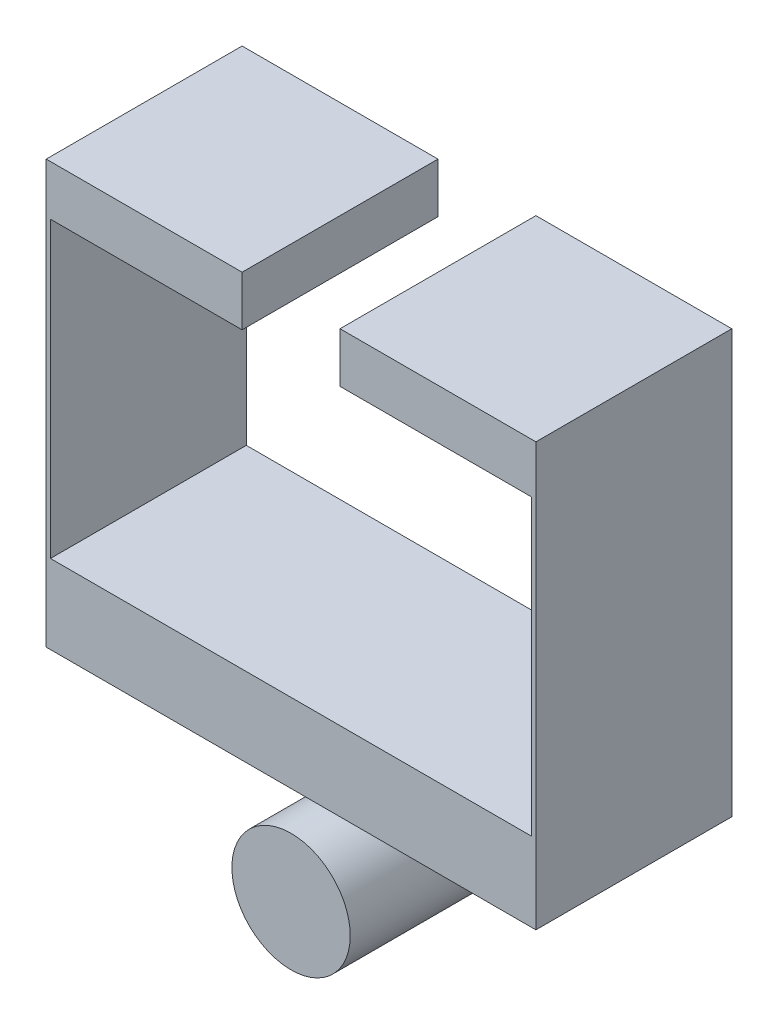
ISO-10303-21;
HEADER;
FILE_DESCRIPTION(('STEP AP214'),'2;1');
FILE_NAME('part.step','',(''),(''),'','','');
FILE_SCHEMA(('AUTOMOTIVE_DESIGN { 1 0 10303 214 1 1 1 1 }'));
ENDSEC;
DATA;
#1=APPLICATION_CONTEXT('core data for automotive mechanical design processes');
#2=APPLICATION_PROTOCOL_DEFINITION('international standard','automotive_design',2000,#1);
#3=PRODUCT_CONTEXT('',#1,'mechanical');
#4=PRODUCT('Part','Part','',(#3));
#5=PRODUCT_RELATED_PRODUCT_CATEGORY('part','',(#4));
#6=PRODUCT_DEFINITION_FORMATION('','',#4);
#7=PRODUCT_DEFINITION_CONTEXT('part definition',#1,'design');
#8=PRODUCT_DEFINITION('design','',#6,#7);
#9=PRODUCT_DEFINITION_SHAPE('','',#8);
#10=(LENGTH_UNIT() NAMED_UNIT(*) SI_UNIT(.MILLI.,.METRE.));
#11=(NAMED_UNIT(*) PLANE_ANGLE_UNIT() SI_UNIT($,.RADIAN.));
#12=(NAMED_UNIT(*) SI_UNIT($,.STERADIAN.) SOLID_ANGLE_UNIT());
#13=UNCERTAINTY_MEASURE_WITH_UNIT(LENGTH_MEASURE(1.E-05),#10,'distance_accuracy_value','');
#14=(GEOMETRIC_REPRESENTATION_CONTEXT(3) GLOBAL_UNCERTAINTY_ASSIGNED_CONTEXT((#13)) GLOBAL_UNIT_ASSIGNED_CONTEXT((#10,
#11,#12)) REPRESENTATION_CONTEXT('',''));
#15=CARTESIAN_POINT('',(0.,0.,0.));
#16=DIRECTION('',(0.,0.,1.));
#17=DIRECTION('',(1.,0.,0.));
#18=AXIS2_PLACEMENT_3D('',#15,#16,#17);
#19=CARTESIAN_POINT('',(0.,0.,25.4));
#20=DIRECTION('',(0.,0.,-1.));
#21=DIRECTION('',(-1.,0.,0.));
#22=AXIS2_PLACEMENT_3D('',#19,#20,#21);
#23=CYLINDRICAL_SURFACE('',#22,7.6728737394168);
#24=CARTESIAN_POINT('',(0.,0.,25.4));
#25=DIRECTION('',(0.,0.,1.));
#26=DIRECTION('',(1.,0.,0.));
#27=AXIS2_PLACEMENT_3D('',#24,#25,#26);
#28=CIRCLE('',#27,7.6728737394168);
#29=CARTESIAN_POINT('',(7.6728737394168,0.,25.4));
#30=VERTEX_POINT('',#29);
#31=EDGE_CURVE('E47',#30,#30,#28,.T.);
#32=ORIENTED_EDGE('',*,*,#31,.F.);
#33=EDGE_LOOP('',(#32));
#34=FACE_BOUND('',#33,.T.);
#35=DIRECTION('',(0.,0.,-1.));
#36=VECTOR('',#35,1.);
#37=CARTESIAN_POINT('',(7.6728737394168,0.,1.82042280849572));
#38=LINE('',#37,#36);
#39=CARTESIAN_POINT('',(7.6728737394168,0.,1.82042280849572));
#40=VERTEX_POINT('',#39);
#41=CARTESIAN_POINT('',(7.6728737394168,0.,0.));
#42=VERTEX_POINT('',#41);
#43=EDGE_CURVE('E266',#40,#42,#38,.T.);
#44=ORIENTED_EDGE('',*,*,#43,.F.);
#45=CARTESIAN_POINT('',(0.,0.,1.82042280849572));
#46=DIRECTION('',(0.,0.,-1.));
#47=DIRECTION('',(-1.,0.,0.));
#48=AXIS2_PLACEMENT_3D('',#45,#46,#47);
#49=CIRCLE('',#48,7.6728737394168);
#50=CARTESIAN_POINT('',(-7.6728737394168,0.,1.82042280849572));
#51=VERTEX_POINT('',#50);
#52=EDGE_CURVE('E11',#51,#40,#49,.T.);
#53=ORIENTED_EDGE('',*,*,#52,.F.);
#54=DIRECTION('',(0.,0.,-1.));
#55=VECTOR('',#54,1.);
#56=CARTESIAN_POINT('',(-7.6728737394168,0.,1.82042280849572));
#57=LINE('',#56,#55);
#58=CARTESIAN_POINT('',(-7.6728737394168,0.,0.));
#59=VERTEX_POINT('',#58);
#60=EDGE_CURVE('E261',#51,#59,#57,.T.);
#61=ORIENTED_EDGE('',*,*,#60,.T.);
#62=CARTESIAN_POINT('',(0.,0.,0.));
#63=DIRECTION('',(0.,0.,1.));
#64=DIRECTION('',(1.,0.,0.));
#65=AXIS2_PLACEMENT_3D('',#62,#63,#64);
#66=CIRCLE('',#65,7.6728737394168);
#67=EDGE_CURVE('E269',#59,#42,#66,.T.);
#68=ORIENTED_EDGE('',*,*,#67,.T.);
#69=EDGE_LOOP('',(#44,#53,#61,#68));
#70=FACE_BOUND('',#69,.T.);
#71=ADVANCED_FACE('F40',(#34,#70),#23,.T.);
#72=CARTESIAN_POINT('',(0.,0.,25.4));
#73=DIRECTION('',(0.,0.,1.));
#74=DIRECTION('',(1.,0.,0.));
#75=AXIS2_PLACEMENT_3D('',#72,#73,#74);
#76=PLANE('',#75);
#77=ORIENTED_EDGE('',*,*,#31,.T.);
#78=EDGE_LOOP('',(#77));
#79=FACE_BOUND('',#78,.T.);
#80=ADVANCED_FACE('F342',(#79),#76,.T.);
#81=CARTESIAN_POINT('',(0.,0.,0.));
#82=DIRECTION('',(0.,0.,1.));
#83=DIRECTION('',(1.,0.,0.));
#84=AXIS2_PLACEMENT_3D('',#81,#82,#83);
#85=PLANE('',#84);
#86=ORIENTED_EDGE('',*,*,#67,.F.);
#87=DIRECTION('',(0.,1.,0.));
#88=VECTOR('',#87,1.);
#89=CARTESIAN_POINT('',(-7.6728737394168,0.,0.));
#90=LINE('',#89,#88);
#91=CARTESIAN_POINT('',(-7.6728737394168,12.7,0.));
#92=VERTEX_POINT('',#91);
#93=EDGE_CURVE('E249',#59,#92,#90,.T.);
#94=ORIENTED_EDGE('',*,*,#93,.T.);
#95=DIRECTION('',(-1.,0.,0.));
#96=VECTOR('',#95,1.);
#97=CARTESIAN_POINT('',(-7.6728737394168,12.7,0.));
#98=LINE('',#97,#96);
#99=CARTESIAN_POINT('',(-31.75,12.7,0.));
#100=VERTEX_POINT('',#99);
#101=EDGE_CURVE('E161',#92,#100,#98,.T.);
#102=ORIENTED_EDGE('',*,*,#101,.T.);
#103=DIRECTION('',(0.,1.,0.));
#104=VECTOR('',#103,1.);
#105=CARTESIAN_POINT('',(-31.75,22.935187233977,0.));
#106=LINE('',#105,#104);
#107=CARTESIAN_POINT('',(-31.75,67.5084880215063,0.));
#108=VERTEX_POINT('',#107);
#109=EDGE_CURVE('E232',#100,#108,#106,.T.);
#110=ORIENTED_EDGE('',*,*,#109,.T.);
#111=DIRECTION('',(1.,0.,0.));
#112=VECTOR('',#111,1.);
#113=CARTESIAN_POINT('',(-31.75,67.5084880215063,0.));
#114=LINE('',#113,#112);
#115=CARTESIAN_POINT('',(-6.35,67.5084880215063,0.));
#116=VERTEX_POINT('',#115);
#117=EDGE_CURVE('E185',#108,#116,#114,.T.);
#118=ORIENTED_EDGE('',*,*,#117,.T.);
#119=DIRECTION('',(0.,-1.,0.));
#120=VECTOR('',#119,1.);
#121=CARTESIAN_POINT('',(-6.35,61.035187233977,0.));
#122=LINE('',#121,#120);
#123=CARTESIAN_POINT('',(-6.35,61.035187233977,0.));
#124=VERTEX_POINT('',#123);
#125=EDGE_CURVE('E202',#116,#124,#122,.T.);
#126=ORIENTED_EDGE('',*,*,#125,.T.);
#127=DIRECTION('',(-1.,0.,0.));
#128=VECTOR('',#127,1.);
#129=CARTESIAN_POINT('',(-31.75,61.035187233977,0.));
#130=LINE('',#129,#128);
#131=CARTESIAN_POINT('',(-31.2000836865377,61.035187233977,0.));
#132=VERTEX_POINT('',#131);
#133=EDGE_CURVE('E194',#124,#132,#130,.T.);
#134=ORIENTED_EDGE('',*,*,#133,.T.);
#135=DIRECTION('',(0.,-1.,0.));
#136=VECTOR('',#135,1.);
#137=CARTESIAN_POINT('',(-31.2000836865377,22.935187233977,0.));
#138=LINE('',#137,#136);
#139=CARTESIAN_POINT('',(-31.2000836865377,22.935187233977,0.));
#140=VERTEX_POINT('',#139);
#141=EDGE_CURVE('E220',#132,#140,#138,.T.);
#142=ORIENTED_EDGE('',*,*,#141,.T.);
#143=DIRECTION('',(1.,0.,0.));
#144=VECTOR('',#143,1.);
#145=CARTESIAN_POINT('',(31.75,22.935187233977,0.));
#146=LINE('',#145,#144);
#147=CARTESIAN_POINT('',(31.2000836865377,22.935187233977,0.));
#148=VERTEX_POINT('',#147);
#149=EDGE_CURVE('E162',#140,#148,#146,.T.);
#150=ORIENTED_EDGE('',*,*,#149,.T.);
#151=DIRECTION('',(0.,1.,0.));
#152=VECTOR('',#151,1.);
#153=CARTESIAN_POINT('',(31.2000836865377,22.935187233977,0.));
#154=LINE('',#153,#152);
#155=CARTESIAN_POINT('',(31.2000836865377,61.035187233977,0.));
#156=VERTEX_POINT('',#155);
#157=EDGE_CURVE('E217',#148,#156,#154,.T.);
#158=ORIENTED_EDGE('',*,*,#157,.T.);
#159=DIRECTION('',(-1.,0.,0.));
#160=VECTOR('',#159,1.);
#161=CARTESIAN_POINT('',(31.75,61.035187233977,0.));
#162=LINE('',#161,#160);
#163=CARTESIAN_POINT('',(6.35,61.035187233977,0.));
#164=VERTEX_POINT('',#163);
#165=EDGE_CURVE('E178',#156,#164,#162,.T.);
#166=ORIENTED_EDGE('',*,*,#165,.T.);
#167=DIRECTION('',(0.,1.,0.));
#168=VECTOR('',#167,1.);
#169=CARTESIAN_POINT('',(6.35,61.035187233977,0.));
#170=LINE('',#169,#168);
#171=CARTESIAN_POINT('',(6.35,67.5084880215063,0.));
#172=VERTEX_POINT('',#171);
#173=EDGE_CURVE('E175',#164,#172,#170,.T.);
#174=ORIENTED_EDGE('',*,*,#173,.T.);
#175=DIRECTION('',(1.,0.,0.));
#176=VECTOR('',#175,1.);
#177=CARTESIAN_POINT('',(31.75,67.5084880215063,0.));
#178=LINE('',#177,#176);
#179=CARTESIAN_POINT('',(31.75,67.5084880215063,0.));
#180=VERTEX_POINT('',#179);
#181=EDGE_CURVE('E167',#172,#180,#178,.T.);
#182=ORIENTED_EDGE('',*,*,#181,.T.);
#183=DIRECTION('',(0.,-1.,0.));
#184=VECTOR('',#183,1.);
#185=CARTESIAN_POINT('',(31.75,12.7,0.));
#186=LINE('',#185,#184);
#187=CARTESIAN_POINT('',(31.75,12.7,0.));
#188=VERTEX_POINT('',#187);
#189=EDGE_CURVE('E151',#180,#188,#186,.T.);
#190=ORIENTED_EDGE('',*,*,#189,.T.);
#191=CARTESIAN_POINT('',(7.6728737394168,12.7,0.));
#192=VERTEX_POINT('',#191);
#193=EDGE_CURVE('E237',#188,#192,#98,.T.);
#194=ORIENTED_EDGE('',*,*,#193,.T.);
#195=DIRECTION('',(0.,-1.,0.));
#196=VECTOR('',#195,1.);
#197=CARTESIAN_POINT('',(7.6728737394168,12.7,0.));
#198=LINE('',#197,#196);
#199=EDGE_CURVE('E255',#192,#42,#198,.T.);
#200=ORIENTED_EDGE('',*,*,#199,.T.);
#201=EDGE_LOOP('',(#86,#94,#102,#110,#118,#126,#134,#142,#150,#158,#166,#174,#182,#190,#194,#200));
#202=FACE_BOUND('',#201,.T.);
#203=ADVANCED_FACE('F173',(#202),#85,.F.);
#204=CARTESIAN_POINT('',(7.6728737394168,12.7,1.82042280849572));
#205=DIRECTION('',(1.,0.,0.));
#206=DIRECTION('',(0.,1.,0.));
#207=AXIS2_PLACEMENT_3D('',#204,#205,#206);
#208=PLANE('',#207);
#209=ORIENTED_EDGE('',*,*,#199,.F.);
#210=DIRECTION('',(0.,0.,-1.));
#211=VECTOR('',#210,1.);
#212=CARTESIAN_POINT('',(7.6728737394168,12.7,1.82042280849572));
#213=LINE('',#212,#211);
#214=CARTESIAN_POINT('',(7.6728737394168,12.7,1.82042280849572));
#215=VERTEX_POINT('',#214);
#216=EDGE_CURVE('E270',#215,#192,#213,.T.);
#217=ORIENTED_EDGE('',*,*,#216,.F.);
#218=DIRECTION('',(0.,-1.,0.));
#219=VECTOR('',#218,1.);
#220=CARTESIAN_POINT('',(7.6728737394168,12.7,1.82042280849572));
#221=LINE('',#220,#219);
#222=EDGE_CURVE('E258',#215,#40,#221,.T.);
#223=ORIENTED_EDGE('',*,*,#222,.T.);
#224=ORIENTED_EDGE('',*,*,#43,.T.);
#225=EDGE_LOOP('',(#209,#217,#223,#224));
#226=FACE_BOUND('',#225,.T.);
#227=ADVANCED_FACE('F282',(#226),#208,.T.);
#228=CARTESIAN_POINT('',(-7.6728737394168,0.,1.82042280849572));
#229=DIRECTION('',(-1.,0.,0.));
#230=DIRECTION('',(0.,0.,1.));
#231=AXIS2_PLACEMENT_3D('',#228,#229,#230);
#232=PLANE('',#231);
#233=ORIENTED_EDGE('',*,*,#93,.F.);
#234=ORIENTED_EDGE('',*,*,#60,.F.);
#235=DIRECTION('',(0.,1.,0.));
#236=VECTOR('',#235,1.);
#237=CARTESIAN_POINT('',(-7.6728737394168,0.,1.82042280849572));
#238=LINE('',#237,#236);
#239=CARTESIAN_POINT('',(-7.6728737394168,12.7,1.82042280849572));
#240=VERTEX_POINT('',#239);
#241=EDGE_CURVE('E251',#51,#240,#238,.T.);
#242=ORIENTED_EDGE('',*,*,#241,.T.);
#243=DIRECTION('',(0.,0.,-1.));
#244=VECTOR('',#243,1.);
#245=CARTESIAN_POINT('',(-7.6728737394168,12.7,1.82042280849572));
#246=LINE('',#245,#244);
#247=EDGE_CURVE('E273',#240,#92,#246,.T.);
#248=ORIENTED_EDGE('',*,*,#247,.T.);
#249=EDGE_LOOP('',(#233,#234,#242,#248));
#250=FACE_BOUND('',#249,.T.);
#251=ADVANCED_FACE('F292',(#250),#232,.T.);
#252=CARTESIAN_POINT('',(0.,0.,1.82042280849572));
#253=DIRECTION('',(0.,0.,-1.));
#254=DIRECTION('',(-1.,0.,0.));
#255=AXIS2_PLACEMENT_3D('',#252,#253,#254);
#256=PLANE('',#255);
#257=ORIENTED_EDGE('',*,*,#241,.F.);
#258=ORIENTED_EDGE('',*,*,#52,.T.);
#259=ORIENTED_EDGE('',*,*,#222,.F.);
#260=DIRECTION('',(1.,0.,0.));
#261=VECTOR('',#260,1.);
#262=CARTESIAN_POINT('',(-7.6728737394168,12.7,1.82042280849572));
#263=LINE('',#262,#261);
#264=EDGE_CURVE('E254',#240,#215,#263,.T.);
#265=ORIENTED_EDGE('',*,*,#264,.F.);
#266=EDGE_LOOP('',(#257,#258,#259,#265));
#267=FACE_BOUND('',#266,.T.);
#268=ADVANCED_FACE('F290',(#267),#256,.F.);
#269=CARTESIAN_POINT('',(-7.6728737394168,12.7,25.4));
#270=DIRECTION('',(0.,-1.,0.));
#271=DIRECTION('',(1.,0.,0.));
#272=AXIS2_PLACEMENT_3D('',#269,#270,#271);
#273=PLANE('',#272);
#274=ORIENTED_EDGE('',*,*,#247,.F.);
#275=ORIENTED_EDGE('',*,*,#264,.T.);
#276=ORIENTED_EDGE('',*,*,#216,.T.);
#277=ORIENTED_EDGE('',*,*,#193,.F.);
#278=DIRECTION('',(0.,0.,-1.));
#279=VECTOR('',#278,1.);
#280=CARTESIAN_POINT('',(31.75,12.7,25.4));
#281=LINE('',#280,#279);
#282=CARTESIAN_POINT('',(31.75,12.7,25.4));
#283=VERTEX_POINT('',#282);
#284=EDGE_CURVE('E157',#283,#188,#281,.T.);
#285=ORIENTED_EDGE('',*,*,#284,.F.);
#286=DIRECTION('',(-1.,0.,0.));
#287=VECTOR('',#286,1.);
#288=CARTESIAN_POINT('',(31.75,12.7,25.4));
#289=LINE('',#288,#287);
#290=CARTESIAN_POINT('',(-31.75,12.7,25.4));
#291=VERTEX_POINT('',#290);
#292=EDGE_CURVE('E241',#283,#291,#289,.T.);
#293=ORIENTED_EDGE('',*,*,#292,.T.);
#294=DIRECTION('',(0.,0.,-1.));
#295=VECTOR('',#294,1.);
#296=CARTESIAN_POINT('',(-31.75,12.7,25.4));
#297=LINE('',#296,#295);
#298=EDGE_CURVE('E246',#291,#100,#297,.T.);
#299=ORIENTED_EDGE('',*,*,#298,.T.);
#300=ORIENTED_EDGE('',*,*,#101,.F.);
#301=EDGE_LOOP('',(#274,#275,#276,#277,#285,#293,#299,#300));
#302=FACE_BOUND('',#301,.T.);
#303=ADVANCED_FACE('F286',(#302),#273,.T.);
#304=CARTESIAN_POINT('',(-31.75,22.935187233977,25.4));
#305=DIRECTION('',(-1.,0.,0.));
#306=DIRECTION('',(0.,0.,1.));
#307=AXIS2_PLACEMENT_3D('',#304,#305,#306);
#308=PLANE('',#307);
#309=ORIENTED_EDGE('',*,*,#109,.F.);
#310=ORIENTED_EDGE('',*,*,#298,.F.);
#311=DIRECTION('',(0.,1.,0.));
#312=VECTOR('',#311,1.);
#313=CARTESIAN_POINT('',(-31.75,22.935187233977,25.4));
#314=LINE('',#313,#312);
#315=CARTESIAN_POINT('',(-31.75,67.5084880215063,25.4));
#316=VERTEX_POINT('',#315);
#317=EDGE_CURVE('E235',#291,#316,#314,.T.);
#318=ORIENTED_EDGE('',*,*,#317,.T.);
#319=DIRECTION('',(0.,0.,-1.));
#320=VECTOR('',#319,1.);
#321=CARTESIAN_POINT('',(-31.75,67.5084880215063,25.4));
#322=LINE('',#321,#320);
#323=EDGE_CURVE('E199',#316,#108,#322,.T.);
#324=ORIENTED_EDGE('',*,*,#323,.T.);
#325=EDGE_LOOP('',(#309,#310,#318,#324));
#326=FACE_BOUND('',#325,.T.);
#327=ADVANCED_FACE('F298',(#326),#308,.T.);
#328=CARTESIAN_POINT('',(31.75,12.7,25.4));
#329=DIRECTION('',(1.,0.,0.));
#330=DIRECTION('',(0.,0.,-1.));
#331=AXIS2_PLACEMENT_3D('',#328,#329,#330);
#332=PLANE('',#331);
#333=ORIENTED_EDGE('',*,*,#189,.F.);
#334=DIRECTION('',(0.,0.,-1.));
#335=VECTOR('',#334,1.);
#336=CARTESIAN_POINT('',(31.75,67.5084880215063,25.4));
#337=LINE('',#336,#335);
#338=CARTESIAN_POINT('',(31.75,67.5084880215063,25.4));
#339=VERTEX_POINT('',#338);
#340=EDGE_CURVE('E155',#339,#180,#337,.T.);
#341=ORIENTED_EDGE('',*,*,#340,.F.);
#342=DIRECTION('',(0.,-1.,0.));
#343=VECTOR('',#342,1.);
#344=CARTESIAN_POINT('',(31.75,12.7,25.4));
#345=LINE('',#344,#343);
#346=EDGE_CURVE('E239',#339,#283,#345,.T.);
#347=ORIENTED_EDGE('',*,*,#346,.T.);
#348=ORIENTED_EDGE('',*,*,#284,.T.);
#349=EDGE_LOOP('',(#333,#341,#347,#348));
#350=FACE_BOUND('',#349,.T.);
#351=ADVANCED_FACE('F153',(#350),#332,.T.);
#352=CARTESIAN_POINT('',(31.75,22.935187233977,25.4));
#353=DIRECTION('',(0.,1.,0.));
#354=DIRECTION('',(0.,0.,1.));
#355=AXIS2_PLACEMENT_3D('',#352,#353,#354);
#356=PLANE('',#355);
#357=DIRECTION('',(0.,0.,-1.));
#358=VECTOR('',#357,1.);
#359=CARTESIAN_POINT('',(31.2000836865377,22.935187233977,25.4));
#360=LINE('',#359,#358);
#361=CARTESIAN_POINT('',(31.2000836865377,22.935187233977,25.4));
#362=VERTEX_POINT('',#361);
#363=EDGE_CURVE('E54',#362,#148,#360,.T.);
#364=ORIENTED_EDGE('',*,*,#363,.T.);
#365=ORIENTED_EDGE('',*,*,#149,.F.);
#366=DIRECTION('',(0.,0.,-1.));
#367=VECTOR('',#366,1.);
#368=CARTESIAN_POINT('',(-31.2000836865377,22.935187233977,25.4));
#369=LINE('',#368,#367);
#370=CARTESIAN_POINT('',(-31.2000836865377,22.935187233977,25.4));
#371=VERTEX_POINT('',#370);
#372=EDGE_CURVE('E229',#371,#140,#369,.T.);
#373=ORIENTED_EDGE('',*,*,#372,.F.);
#374=DIRECTION('',(1.,0.,0.));
#375=VECTOR('',#374,1.);
#376=CARTESIAN_POINT('',(31.75,22.935187233977,25.4));
#377=LINE('',#376,#375);
#378=EDGE_CURVE('E59',#371,#362,#377,.T.);
#379=ORIENTED_EDGE('',*,*,#378,.T.);
#380=EDGE_LOOP('',(#364,#365,#373,#379));
#381=FACE_BOUND('',#380,.T.);
#382=ADVANCED_FACE('F318',(#381),#356,.T.);
#383=CARTESIAN_POINT('',(0.,0.,25.4));
#384=DIRECTION('',(0.,0.,-1.));
#385=DIRECTION('',(-1.,0.,0.));
#386=AXIS2_PLACEMENT_3D('',#383,#384,#385);
#387=PLANE('',#386);
#388=ORIENTED_EDGE('',*,*,#317,.F.);
#389=ORIENTED_EDGE('',*,*,#292,.F.);
#390=ORIENTED_EDGE('',*,*,#346,.F.);
#391=DIRECTION('',(1.,0.,0.));
#392=VECTOR('',#391,1.);
#393=CARTESIAN_POINT('',(31.75,67.5084880215063,25.4));
#394=LINE('',#393,#392);
#395=CARTESIAN_POINT('',(6.35,67.5084880215063,25.4));
#396=VERTEX_POINT('',#395);
#397=EDGE_CURVE('E169',#396,#339,#394,.T.);
#398=ORIENTED_EDGE('',*,*,#397,.F.);
#399=DIRECTION('',(0.,1.,0.));
#400=VECTOR('',#399,1.);
#401=CARTESIAN_POINT('',(6.35,61.035187233977,25.4));
#402=LINE('',#401,#400);
#403=CARTESIAN_POINT('',(6.35,61.035187233977,25.4));
#404=VERTEX_POINT('',#403);
#405=EDGE_CURVE('E180',#404,#396,#402,.T.);
#406=ORIENTED_EDGE('',*,*,#405,.F.);
#407=DIRECTION('',(-1.,0.,0.));
#408=VECTOR('',#407,1.);
#409=CARTESIAN_POINT('',(31.75,61.035187233977,25.4));
#410=LINE('',#409,#408);
#411=CARTESIAN_POINT('',(31.2000836865377,61.035187233977,25.4));
#412=VERTEX_POINT('',#411);
#413=EDGE_CURVE('E176',#412,#404,#410,.T.);
#414=ORIENTED_EDGE('',*,*,#413,.F.);
#415=DIRECTION('',(0.,1.,0.));
#416=VECTOR('',#415,1.);
#417=CARTESIAN_POINT('',(31.2000836865377,22.935187233977,25.4));
#418=LINE('',#417,#416);
#419=EDGE_CURVE('E214',#362,#412,#418,.T.);
#420=ORIENTED_EDGE('',*,*,#419,.F.);
#421=ORIENTED_EDGE('',*,*,#378,.F.);
#422=DIRECTION('',(0.,-1.,0.));
#423=VECTOR('',#422,1.);
#424=CARTESIAN_POINT('',(-31.2000836865377,22.935187233977,25.4));
#425=LINE('',#424,#423);
#426=CARTESIAN_POINT('',(-31.2000836865377,61.035187233977,25.4));
#427=VERTEX_POINT('',#426);
#428=EDGE_CURVE('E223',#427,#371,#425,.T.);
#429=ORIENTED_EDGE('',*,*,#428,.F.);
#430=DIRECTION('',(-1.,0.,0.));
#431=VECTOR('',#430,1.);
#432=CARTESIAN_POINT('',(-31.75,61.035187233977,25.4));
#433=LINE('',#432,#431);
#434=CARTESIAN_POINT('',(-6.35,61.035187233977,25.4));
#435=VERTEX_POINT('',#434);
#436=EDGE_CURVE('E197',#435,#427,#433,.T.);
#437=ORIENTED_EDGE('',*,*,#436,.F.);
#438=DIRECTION('',(0.,-1.,0.));
#439=VECTOR('',#438,1.);
#440=CARTESIAN_POINT('',(-6.35,61.035187233977,25.4));
#441=LINE('',#440,#439);
#442=CARTESIAN_POINT('',(-6.35,67.5084880215063,25.4));
#443=VERTEX_POINT('',#442);
#444=EDGE_CURVE('E193',#443,#435,#441,.T.);
#445=ORIENTED_EDGE('',*,*,#444,.F.);
#446=DIRECTION('',(1.,0.,0.));
#447=VECTOR('',#446,1.);
#448=CARTESIAN_POINT('',(-31.75,67.5084880215063,25.4));
#449=LINE('',#448,#447);
#450=EDGE_CURVE('E190',#316,#443,#449,.T.);
#451=ORIENTED_EDGE('',*,*,#450,.F.);
#452=EDGE_LOOP('',(#388,#389,#390,#398,#406,#414,#420,#421,#429,#437,#445,#451));
#453=FACE_BOUND('',#452,.T.);
#454=ADVANCED_FACE('F321',(#453),#387,.F.);
#455=CARTESIAN_POINT('',(-31.2000836865377,22.935187233977,25.4));
#456=DIRECTION('',(1.,0.,0.));
#457=DIRECTION('',(0.,0.,-1.));
#458=AXIS2_PLACEMENT_3D('',#455,#456,#457);
#459=PLANE('',#458);
#460=ORIENTED_EDGE('',*,*,#141,.F.);
#461=DIRECTION('',(0.,0.,-1.));
#462=VECTOR('',#461,1.);
#463=CARTESIAN_POINT('',(-31.2000836865377,61.035187233977,25.4));
#464=LINE('',#463,#462);
#465=EDGE_CURVE('E226',#427,#132,#464,.T.);
#466=ORIENTED_EDGE('',*,*,#465,.F.);
#467=ORIENTED_EDGE('',*,*,#428,.T.);
#468=ORIENTED_EDGE('',*,*,#372,.T.);
#469=EDGE_LOOP('',(#460,#466,#467,#468));
#470=FACE_BOUND('',#469,.T.);
#471=ADVANCED_FACE('F316',(#470),#459,.T.);
#472=CARTESIAN_POINT('',(31.2000836865377,22.935187233977,25.4));
#473=DIRECTION('',(-1.,0.,0.));
#474=DIRECTION('',(0.,0.,1.));
#475=AXIS2_PLACEMENT_3D('',#472,#473,#474);
#476=PLANE('',#475);
#477=ORIENTED_EDGE('',*,*,#157,.F.);
#478=ORIENTED_EDGE('',*,*,#363,.F.);
#479=ORIENTED_EDGE('',*,*,#419,.T.);
#480=DIRECTION('',(0.,0.,-1.));
#481=VECTOR('',#480,1.);
#482=CARTESIAN_POINT('',(31.2000836865377,61.035187233977,25.4));
#483=LINE('',#482,#481);
#484=EDGE_CURVE('E208',#412,#156,#483,.T.);
#485=ORIENTED_EDGE('',*,*,#484,.T.);
#486=EDGE_LOOP('',(#477,#478,#479,#485));
#487=FACE_BOUND('',#486,.T.);
#488=ADVANCED_FACE('F325',(#487),#476,.T.);
#489=CARTESIAN_POINT('',(-31.75,61.035187233977,25.4));
#490=DIRECTION('',(0.,-1.,0.));
#491=DIRECTION('',(0.,0.,-1.));
#492=AXIS2_PLACEMENT_3D('',#489,#490,#491);
#493=PLANE('',#492);
#494=ORIENTED_EDGE('',*,*,#436,.T.);
#495=ORIENTED_EDGE('',*,*,#465,.T.);
#496=ORIENTED_EDGE('',*,*,#133,.F.);
#497=DIRECTION('',(0.,0.,-1.));
#498=VECTOR('',#497,1.);
#499=CARTESIAN_POINT('',(-6.35,61.035187233977,25.4));
#500=LINE('',#499,#498);
#501=EDGE_CURVE('E206',#435,#124,#500,.T.);
#502=ORIENTED_EDGE('',*,*,#501,.F.);
#503=EDGE_LOOP('',(#494,#495,#496,#502));
#504=FACE_BOUND('',#503,.T.);
#505=ADVANCED_FACE('F311',(#504),#493,.T.);
#506=CARTESIAN_POINT('',(-6.35,61.035187233977,25.4));
#507=DIRECTION('',(1.,0.,0.));
#508=DIRECTION('',(0.,0.,-1.));
#509=AXIS2_PLACEMENT_3D('',#506,#507,#508);
#510=PLANE('',#509);
#511=ORIENTED_EDGE('',*,*,#125,.F.);
#512=DIRECTION('',(0.,0.,-1.));
#513=VECTOR('',#512,1.);
#514=CARTESIAN_POINT('',(-6.35,67.5084880215063,25.4));
#515=LINE('',#514,#513);
#516=EDGE_CURVE('E209',#443,#116,#515,.T.);
#517=ORIENTED_EDGE('',*,*,#516,.F.);
#518=ORIENTED_EDGE('',*,*,#444,.T.);
#519=ORIENTED_EDGE('',*,*,#501,.T.);
#520=EDGE_LOOP('',(#511,#517,#518,#519));
#521=FACE_BOUND('',#520,.T.);
#522=ADVANCED_FACE('F308',(#521),#510,.T.);
#523=CARTESIAN_POINT('',(-31.75,67.5084880215063,25.4));
#524=DIRECTION('',(0.,1.,0.));
#525=DIRECTION('',(0.,0.,1.));
#526=AXIS2_PLACEMENT_3D('',#523,#524,#525);
#527=PLANE('',#526);
#528=ORIENTED_EDGE('',*,*,#117,.F.);
#529=ORIENTED_EDGE('',*,*,#323,.F.);
#530=ORIENTED_EDGE('',*,*,#450,.T.);
#531=ORIENTED_EDGE('',*,*,#516,.T.);
#532=EDGE_LOOP('',(#528,#529,#530,#531));
#533=FACE_BOUND('',#532,.T.);
#534=ADVANCED_FACE('F304',(#533),#527,.T.);
#535=CARTESIAN_POINT('',(31.75,67.5084880215063,25.4));
#536=DIRECTION('',(0.,1.,0.));
#537=DIRECTION('',(0.,0.,1.));
#538=AXIS2_PLACEMENT_3D('',#535,#536,#537);
#539=PLANE('',#538);
#540=ORIENTED_EDGE('',*,*,#181,.F.);
#541=DIRECTION('',(0.,0.,-1.));
#542=VECTOR('',#541,1.);
#543=CARTESIAN_POINT('',(6.35,67.5084880215063,25.4));
#544=LINE('',#543,#542);
#545=EDGE_CURVE('E170',#396,#172,#544,.T.);
#546=ORIENTED_EDGE('',*,*,#545,.F.);
#547=ORIENTED_EDGE('',*,*,#397,.T.);
#548=ORIENTED_EDGE('',*,*,#340,.T.);
#549=EDGE_LOOP('',(#540,#546,#547,#548));
#550=FACE_BOUND('',#549,.T.);
#551=ADVANCED_FACE('F166',(#550),#539,.T.);
#552=CARTESIAN_POINT('',(6.35,61.035187233977,25.4));
#553=DIRECTION('',(-1.,0.,0.));
#554=DIRECTION('',(0.,0.,1.));
#555=AXIS2_PLACEMENT_3D('',#552,#553,#554);
#556=PLANE('',#555);
#557=ORIENTED_EDGE('',*,*,#173,.F.);
#558=DIRECTION('',(0.,0.,-1.));
#559=VECTOR('',#558,1.);
#560=CARTESIAN_POINT('',(6.35,61.035187233977,25.4));
#561=LINE('',#560,#559);
#562=EDGE_CURVE('E187',#404,#164,#561,.T.);
#563=ORIENTED_EDGE('',*,*,#562,.F.);
#564=ORIENTED_EDGE('',*,*,#405,.T.);
#565=ORIENTED_EDGE('',*,*,#545,.T.);
#566=EDGE_LOOP('',(#557,#563,#564,#565));
#567=FACE_BOUND('',#566,.T.);
#568=ADVANCED_FACE('F332',(#567),#556,.T.);
#569=CARTESIAN_POINT('',(31.75,61.035187233977,25.4));
#570=DIRECTION('',(0.,-1.,0.));
#571=DIRECTION('',(0.,0.,-1.));
#572=AXIS2_PLACEMENT_3D('',#569,#570,#571);
#573=PLANE('',#572);
#574=ORIENTED_EDGE('',*,*,#165,.F.);
#575=ORIENTED_EDGE('',*,*,#484,.F.);
#576=ORIENTED_EDGE('',*,*,#413,.T.);
#577=ORIENTED_EDGE('',*,*,#562,.T.);
#578=EDGE_LOOP('',(#574,#575,#576,#577));
#579=FACE_BOUND('',#578,.T.);
#580=ADVANCED_FACE('F329',(#579),#573,.T.);
#581=CLOSED_SHELL('',(#71,#80,#203,#227,#251,#268,#303,#327,#351,#382,#454,#471,#488,#505,#522,
#534,#551,#568,#580));
#582=MANIFOLD_SOLID_BREP('B2',#581);
#583=ADVANCED_BREP_SHAPE_REPRESENTATION('',(#18,#582),#14);
#584=SHAPE_DEFINITION_REPRESENTATION(#9,#583);
ENDSEC;
END-ISO-10303-21;
